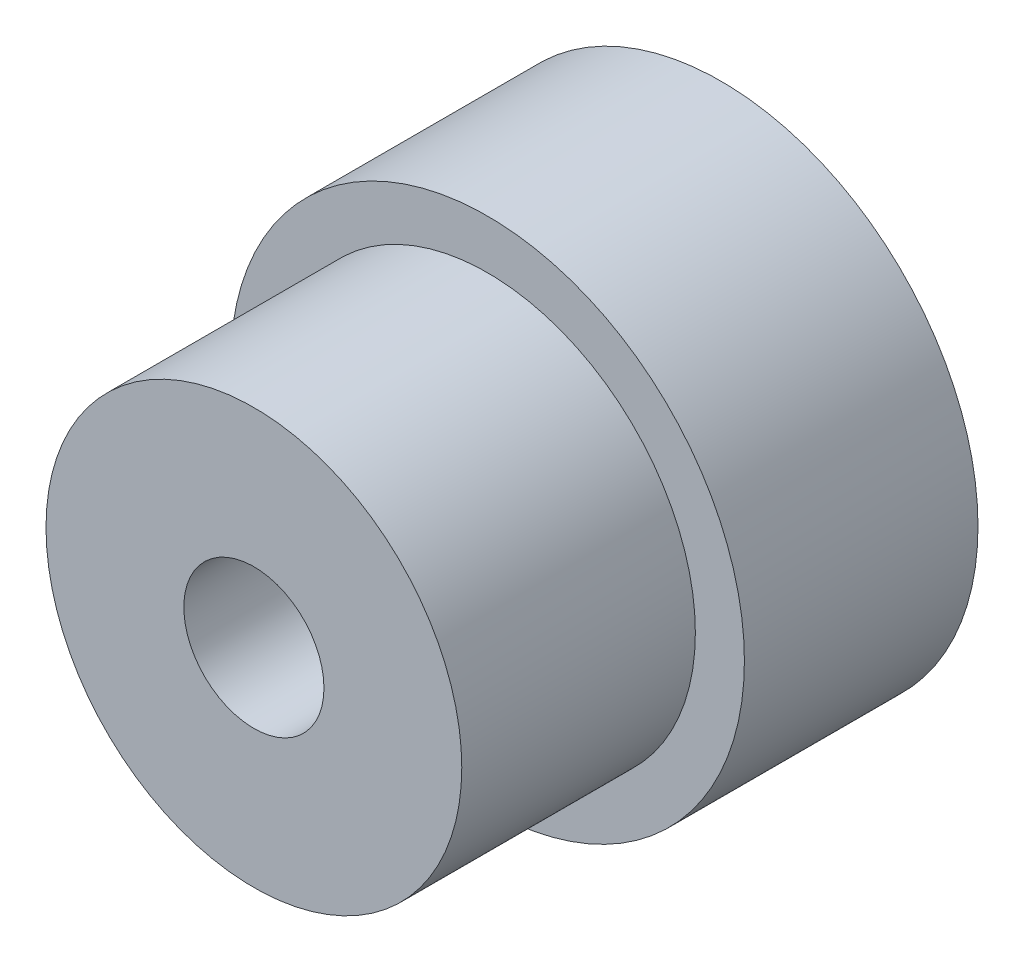
ISO-10303-21;
HEADER;
FILE_DESCRIPTION(('STEP AP214'),'2;1');
FILE_NAME('part.step','',(''),(''),'','','');
FILE_SCHEMA(('AUTOMOTIVE_DESIGN { 1 0 10303 214 1 1 1 1 }'));
ENDSEC;
DATA;
#1=APPLICATION_CONTEXT('core data for automotive mechanical design processes');
#2=APPLICATION_PROTOCOL_DEFINITION('international standard','automotive_design',2000,#1);
#3=PRODUCT_CONTEXT('',#1,'mechanical');
#4=PRODUCT('Part','Part','',(#3));
#5=PRODUCT_RELATED_PRODUCT_CATEGORY('part','',(#4));
#6=PRODUCT_DEFINITION_FORMATION('','',#4);
#7=PRODUCT_DEFINITION_CONTEXT('part definition',#1,'design');
#8=PRODUCT_DEFINITION('design','',#6,#7);
#9=PRODUCT_DEFINITION_SHAPE('','',#8);
#10=(LENGTH_UNIT() NAMED_UNIT(*) SI_UNIT(.MILLI.,.METRE.));
#11=(NAMED_UNIT(*) PLANE_ANGLE_UNIT() SI_UNIT($,.RADIAN.));
#12=(NAMED_UNIT(*) SI_UNIT($,.STERADIAN.) SOLID_ANGLE_UNIT());
#13=UNCERTAINTY_MEASURE_WITH_UNIT(LENGTH_MEASURE(1.E-05),#10,'distance_accuracy_value','');
#14=(GEOMETRIC_REPRESENTATION_CONTEXT(3) GLOBAL_UNCERTAINTY_ASSIGNED_CONTEXT((#13)) GLOBAL_UNIT_ASSIGNED_CONTEXT((#10,
#11,#12)) REPRESENTATION_CONTEXT('',''));
#15=CARTESIAN_POINT('',(0.,0.,0.));
#16=DIRECTION('',(0.,0.,1.));
#17=DIRECTION('',(1.,0.,0.));
#18=AXIS2_PLACEMENT_3D('',#15,#16,#17);
#19=CARTESIAN_POINT('',(0.,0.,5.));
#20=DIRECTION('',(0.,0.,-1.));
#21=DIRECTION('',(-1.,0.,0.));
#22=AXIS2_PLACEMENT_3D('',#19,#20,#21);
#23=CYLINDRICAL_SURFACE('',#22,5.5);
#24=CARTESIAN_POINT('',(0.,0.,5.));
#25=DIRECTION('',(0.,0.,1.));
#26=DIRECTION('',(1.,0.,0.));
#27=AXIS2_PLACEMENT_3D('',#24,#25,#26);
#28=CIRCLE('',#27,5.5);
#29=CARTESIAN_POINT('',(5.5,0.,5.));
#30=VERTEX_POINT('',#29);
#31=EDGE_CURVE('E47',#30,#30,#28,.T.);
#32=ORIENTED_EDGE('',*,*,#31,.F.);
#33=EDGE_LOOP('',(#32));
#34=FACE_BOUND('',#33,.T.);
#35=CARTESIAN_POINT('',(0.,0.,0.));
#36=DIRECTION('',(0.,0.,1.));
#37=DIRECTION('',(1.,0.,0.));
#38=AXIS2_PLACEMENT_3D('',#35,#36,#37);
#39=CIRCLE('',#38,5.5);
#40=CARTESIAN_POINT('',(5.5,0.,0.));
#41=VERTEX_POINT('',#40);
#42=EDGE_CURVE('E42',#41,#41,#39,.T.);
#43=ORIENTED_EDGE('',*,*,#42,.T.);
#44=EDGE_LOOP('',(#43));
#45=FACE_BOUND('',#44,.T.);
#46=ADVANCED_FACE('F39',(#34,#45),#23,.T.);
#47=CARTESIAN_POINT('',(0.,0.,5.));
#48=DIRECTION('',(0.,0.,1.));
#49=DIRECTION('',(1.,0.,0.));
#50=AXIS2_PLACEMENT_3D('',#47,#48,#49);
#51=PLANE('',#50);
#52=CARTESIAN_POINT('',(0.,0.,5.));
#53=DIRECTION('',(0.,0.,1.));
#54=DIRECTION('',(1.,0.,0.));
#55=AXIS2_PLACEMENT_3D('',#52,#53,#54);
#56=CIRCLE('',#55,4.45);
#57=CARTESIAN_POINT('',(4.45,0.,5.));
#58=VERTEX_POINT('',#57);
#59=EDGE_CURVE('E10',#58,#58,#56,.T.);
#60=ORIENTED_EDGE('',*,*,#59,.F.);
#61=EDGE_LOOP('',(#60));
#62=FACE_BOUND('',#61,.T.);
#63=ORIENTED_EDGE('',*,*,#31,.T.);
#64=EDGE_LOOP('',(#63));
#65=FACE_BOUND('',#64,.T.);
#66=ADVANCED_FACE('F88',(#62,#65),#51,.T.);
#67=CARTESIAN_POINT('',(0.,0.,0.));
#68=DIRECTION('',(0.,0.,1.));
#69=DIRECTION('',(1.,0.,0.));
#70=AXIS2_PLACEMENT_3D('',#67,#68,#69);
#71=PLANE('',#70);
#72=CARTESIAN_POINT('',(0.,0.,0.));
#73=DIRECTION('',(0.,0.,1.));
#74=DIRECTION('',(1.,0.,0.));
#75=AXIS2_PLACEMENT_3D('',#72,#73,#74);
#76=CIRCLE('',#75,1.5);
#77=CARTESIAN_POINT('',(1.5,0.,0.));
#78=VERTEX_POINT('',#77);
#79=EDGE_CURVE('E58',#78,#78,#76,.T.);
#80=ORIENTED_EDGE('',*,*,#79,.T.);
#81=EDGE_LOOP('',(#80));
#82=FACE_BOUND('',#81,.T.);
#83=ORIENTED_EDGE('',*,*,#42,.F.);
#84=EDGE_LOOP('',(#83));
#85=FACE_BOUND('',#84,.T.);
#86=ADVANCED_FACE('F67',(#82,#85),#71,.F.);
#87=CARTESIAN_POINT('',(0.,0.,10.));
#88=DIRECTION('',(0.,0.,-1.));
#89=DIRECTION('',(-1.,0.,0.));
#90=AXIS2_PLACEMENT_3D('',#87,#88,#89);
#91=CYLINDRICAL_SURFACE('',#90,4.45);
#92=CARTESIAN_POINT('',(0.,0.,10.));
#93=DIRECTION('',(0.,0.,1.));
#94=DIRECTION('',(1.,0.,0.));
#95=AXIS2_PLACEMENT_3D('',#92,#93,#94);
#96=CIRCLE('',#95,4.45);
#97=CARTESIAN_POINT('',(4.45,0.,10.));
#98=VERTEX_POINT('',#97);
#99=EDGE_CURVE('E54',#98,#98,#96,.T.);
#100=ORIENTED_EDGE('',*,*,#99,.F.);
#101=EDGE_LOOP('',(#100));
#102=FACE_BOUND('',#101,.T.);
#103=ORIENTED_EDGE('',*,*,#59,.T.);
#104=EDGE_LOOP('',(#103));
#105=FACE_BOUND('',#104,.T.);
#106=ADVANCED_FACE('F79',(#102,#105),#91,.T.);
#107=CARTESIAN_POINT('',(0.,0.,10.));
#108=DIRECTION('',(0.,0.,1.));
#109=DIRECTION('',(1.,0.,0.));
#110=AXIS2_PLACEMENT_3D('',#107,#108,#109);
#111=PLANE('',#110);
#112=CARTESIAN_POINT('',(0.,0.,10.));
#113=DIRECTION('',(0.,0.,1.));
#114=DIRECTION('',(1.,0.,0.));
#115=AXIS2_PLACEMENT_3D('',#112,#113,#114);
#116=CIRCLE('',#115,1.5);
#117=CARTESIAN_POINT('',(1.5,0.,10.));
#118=VERTEX_POINT('',#117);
#119=EDGE_CURVE('E59',#118,#118,#116,.T.);
#120=ORIENTED_EDGE('',*,*,#119,.F.);
#121=EDGE_LOOP('',(#120));
#122=FACE_BOUND('',#121,.T.);
#123=ORIENTED_EDGE('',*,*,#99,.T.);
#124=EDGE_LOOP('',(#123));
#125=FACE_BOUND('',#124,.T.);
#126=ADVANCED_FACE('F73',(#122,#125),#111,.T.);
#127=CARTESIAN_POINT('',(0.,0.,0.));
#128=DIRECTION('',(0.,0.,1.));
#129=DIRECTION('',(1.,0.,0.));
#130=AXIS2_PLACEMENT_3D('',#127,#128,#129);
#131=CYLINDRICAL_SURFACE('',#130,1.5);
#132=ORIENTED_EDGE('',*,*,#79,.F.);
#133=EDGE_LOOP('',(#132));
#134=FACE_BOUND('',#133,.T.);
#135=ORIENTED_EDGE('',*,*,#119,.T.);
#136=EDGE_LOOP('',(#135));
#137=FACE_BOUND('',#136,.T.);
#138=ADVANCED_FACE('F70',(#134,#137),#131,.F.);
#139=CLOSED_SHELL('',(#46,#66,#86,#106,#126,#138));
#140=MANIFOLD_SOLID_BREP('B2',#139);
#141=ADVANCED_BREP_SHAPE_REPRESENTATION('',(#18,#140),#14);
#142=SHAPE_DEFINITION_REPRESENTATION(#9,#141);
ENDSEC;
END-ISO-10303-21;
